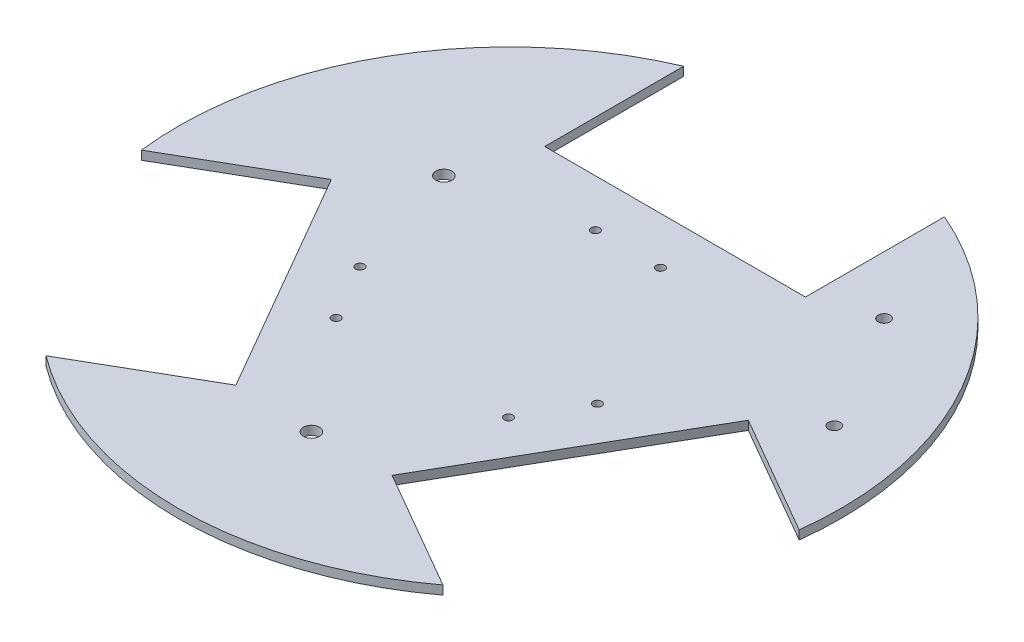
ISO-10303-21;
HEADER;
FILE_DESCRIPTION(('STEP AP214'),'2;1');
FILE_NAME('part.step','',(''),(''),'','','');
FILE_SCHEMA(('AUTOMOTIVE_DESIGN { 1 0 10303 214 1 1 1 1 }'));
ENDSEC;
DATA;
#1=APPLICATION_CONTEXT('core data for automotive mechanical design processes');
#2=APPLICATION_PROTOCOL_DEFINITION('international standard','automotive_design',2000,#1);
#3=PRODUCT_CONTEXT('',#1,'mechanical');
#4=PRODUCT('Part','Part','',(#3));
#5=PRODUCT_RELATED_PRODUCT_CATEGORY('part','',(#4));
#6=PRODUCT_DEFINITION_FORMATION('','',#4);
#7=PRODUCT_DEFINITION_CONTEXT('part definition',#1,'design');
#8=PRODUCT_DEFINITION('design','',#6,#7);
#9=PRODUCT_DEFINITION_SHAPE('','',#8);
#10=(LENGTH_UNIT() NAMED_UNIT(*) SI_UNIT(.MILLI.,.METRE.));
#11=(NAMED_UNIT(*) PLANE_ANGLE_UNIT() SI_UNIT($,.RADIAN.));
#12=(NAMED_UNIT(*) SI_UNIT($,.STERADIAN.) SOLID_ANGLE_UNIT());
#13=UNCERTAINTY_MEASURE_WITH_UNIT(LENGTH_MEASURE(1.E-05),#10,'distance_accuracy_value','');
#14=(GEOMETRIC_REPRESENTATION_CONTEXT(3) GLOBAL_UNCERTAINTY_ASSIGNED_CONTEXT((#13)) GLOBAL_UNIT_ASSIGNED_CONTEXT((#10,
#11,#12)) REPRESENTATION_CONTEXT('',''));
#15=CARTESIAN_POINT('',(0.,0.,0.));
#16=DIRECTION('',(0.,0.,1.));
#17=DIRECTION('',(1.,0.,0.));
#18=AXIS2_PLACEMENT_3D('',#15,#16,#17);
#19=CARTESIAN_POINT('',(0.,2.3622,0.));
#20=DIRECTION('',(0.,1.,0.));
#21=DIRECTION('',(0.,0.,1.));
#22=AXIS2_PLACEMENT_3D('',#19,#20,#21);
#23=PLANE('',#22);
#24=CARTESIAN_POINT('',(-31.8619315701551,2.3622,8.31351569320629));
#25=DIRECTION('',(0.,1.,0.));
#26=DIRECTION('',(0.,0.,1.));
#27=AXIS2_PLACEMENT_3D('',#24,#25,#26);
#28=CIRCLE('',#27,1.14935);
#29=CARTESIAN_POINT('',(-31.8619315701551,2.3622,9.46286569320629));
#30=VERTEX_POINT('',#29);
#31=EDGE_CURVE('E315',#30,#30,#28,.T.);
#32=ORIENTED_EDGE('',*,*,#31,.F.);
#33=EDGE_LOOP('',(#32));
#34=FACE_BOUND('',#33,.T.);
#35=CARTESIAN_POINT('',(31.8619315701559,2.3622,8.31351569320727));
#36=DIRECTION('',(0.,1.,0.));
#37=DIRECTION('',(0.,0.,1.));
#38=AXIS2_PLACEMENT_3D('',#35,#36,#37);
#39=CIRCLE('',#38,1.14935);
#40=CARTESIAN_POINT('',(31.8619315701559,2.3622,9.46286569320727));
#41=VERTEX_POINT('',#40);
#42=EDGE_CURVE('E327',#41,#41,#39,.T.);
#43=ORIENTED_EDGE('',*,*,#42,.F.);
#44=EDGE_LOOP('',(#43));
#45=FACE_BOUND('',#44,.T.);
#46=CARTESIAN_POINT('',(0.,2.3622,53.2057621135311));
#47=DIRECTION('',(0.,1.,0.));
#48=DIRECTION('',(0.,0.,-1.));
#49=AXIS2_PLACEMENT_3D('',#46,#47,#48);
#50=CIRCLE('',#49,2.1463);
#51=CARTESIAN_POINT('',(0.,2.3622,51.0594621135311));
#52=VERTEX_POINT('',#51);
#53=EDGE_CURVE('E339',#52,#52,#50,.T.);
#54=ORIENTED_EDGE('',*,*,#53,.F.);
#55=EDGE_LOOP('',(#54));
#56=FACE_BOUND('',#55,.T.);
#57=CARTESIAN_POINT('',(-8.73125,2.3622,-31.75));
#58=DIRECTION('',(0.,1.,0.));
#59=DIRECTION('',(0.,0.,1.));
#60=AXIS2_PLACEMENT_3D('',#57,#58,#59);
#61=CIRCLE('',#60,1.14935);
#62=CARTESIAN_POINT('',(-8.73125,2.3622,-30.60065));
#63=VERTEX_POINT('',#62);
#64=EDGE_CURVE('E351',#63,#63,#61,.T.);
#65=ORIENTED_EDGE('',*,*,#64,.F.);
#66=EDGE_LOOP('',(#65));
#67=FACE_BOUND('',#66,.T.);
#68=CARTESIAN_POINT('',(-41.7474145991068,2.3622,-24.1028810567702));
#69=DIRECTION('',(0.,1.,0.));
#70=DIRECTION('',(0.,0.,1.));
#71=AXIS2_PLACEMENT_3D('',#68,#69,#70);
#72=CIRCLE('',#71,2.1463);
#73=CARTESIAN_POINT('',(-41.7474145991068,2.3622,-21.9565810567702));
#74=VERTEX_POINT('',#73);
#75=EDGE_CURVE('E157',#74,#74,#72,.T.);
#76=ORIENTED_EDGE('',*,*,#75,.F.);
#77=EDGE_LOOP('',(#76));
#78=FACE_BOUND('',#77,.T.);
#79=CARTESIAN_POINT('',(0.,2.3622,0.));
#80=DIRECTION('',(0.,1.,0.));
#81=DIRECTION('',(0.,0.,1.));
#82=AXIS2_PLACEMENT_3D('',#79,#80,#81);
#83=CIRCLE('',#82,88.9);
#84=CARTESIAN_POINT('',(-53.2718694115166,2.3622,71.1710469882404));
#85=VERTEX_POINT('',#84);
#86=CARTESIAN_POINT('',(53.271869411513,2.3622,71.1710469882431));
#87=VERTEX_POINT('',#86);
#88=EDGE_CURVE('E176',#85,#87,#83,.T.);
#89=ORIENTED_EDGE('',*,*,#88,.T.);
#90=DIRECTION('',(-0.866025403784439,0.,-0.5));
#91=VECTOR('',#90,1.);
#92=CARTESIAN_POINT('',(20.9618354824669,2.3622,52.5168402017824));
#93=LINE('',#92,#91);
#94=CARTESIAN_POINT('',(20.9618354824669,2.3622,52.5168402017824));
#95=VERTEX_POINT('',#94);
#96=EDGE_CURVE('E104',#87,#95,#93,.T.);
#97=ORIENTED_EDGE('',*,*,#96,.T.);
#98=DIRECTION('',(0.5,0.,-0.866025403784439));
#99=VECTOR('',#98,1.);
#100=CARTESIAN_POINT('',(55.9618354824629,2.3622,-8.10493806312137));
#101=LINE('',#100,#99);
#102=CARTESIAN_POINT('',(55.9618354824629,2.3622,-8.10493806312137));
#103=VERTEX_POINT('',#102);
#104=EDGE_CURVE('E203',#95,#103,#101,.T.);
#105=ORIENTED_EDGE('',*,*,#104,.T.);
#106=DIRECTION('',(0.866025403784437,0.,0.500000000000002));
#107=VECTOR('',#106,1.);
#108=CARTESIAN_POINT('',(55.9618354824629,2.3622,-8.10493806312137));
#109=LINE('',#108,#107);
#110=CARTESIAN_POINT('',(88.2718694115104,2.3622,10.5492687233403));
#111=VERTEX_POINT('',#110);
#112=EDGE_CURVE('E222',#103,#111,#109,.T.);
#113=ORIENTED_EDGE('',*,*,#112,.T.);
#114=CARTESIAN_POINT('',(0.,2.3622,0.));
#115=DIRECTION('',(0.,1.,0.));
#116=DIRECTION('',(0.,0.,1.));
#117=AXIS2_PLACEMENT_3D('',#114,#115,#116);
#118=CIRCLE('',#117,88.9);
#119=CARTESIAN_POINT('',(34.999999999998,2.3622,-81.7203157115789));
#120=VERTEX_POINT('',#119);
#121=EDGE_CURVE('E219',#111,#120,#118,.T.);
#122=ORIENTED_EDGE('',*,*,#121,.T.);
#123=DIRECTION('',(0.,0.,1.));
#124=VECTOR('',#123,1.);
#125=CARTESIAN_POINT('',(34.999999999998,2.3622,-44.4119021386576));
#126=LINE('',#125,#124);
#127=CARTESIAN_POINT('',(34.999999999998,2.3622,-44.4119021386576));
#128=VERTEX_POINT('',#127);
#129=EDGE_CURVE('E221',#120,#128,#126,.T.);
#130=ORIENTED_EDGE('',*,*,#129,.T.);
#131=DIRECTION('',(-1.,0.,0.));
#132=VECTOR('',#131,1.);
#133=CARTESIAN_POINT('',(-34.999999999994,2.3622,-44.4119021386576));
#134=LINE('',#133,#132);
#135=CARTESIAN_POINT('',(-34.999999999994,2.3622,-44.4119021386576));
#136=VERTEX_POINT('',#135);
#137=EDGE_CURVE('E224',#128,#136,#134,.T.);
#138=ORIENTED_EDGE('',*,*,#137,.T.);
#139=DIRECTION('',(0.,0.,-1.));
#140=VECTOR('',#139,1.);
#141=CARTESIAN_POINT('',(-34.999999999994,2.3622,-44.4119021386576));
#142=LINE('',#141,#140);
#143=CARTESIAN_POINT('',(-34.9999999999939,2.3622,-81.7203157115807));
#144=VERTEX_POINT('',#143);
#145=EDGE_CURVE('E230',#136,#144,#142,.T.);
#146=ORIENTED_EDGE('',*,*,#145,.T.);
#147=CARTESIAN_POINT('',(0.,2.3622,0.));
#148=DIRECTION('',(0.,1.,0.));
#149=DIRECTION('',(0.,0.,1.));
#150=AXIS2_PLACEMENT_3D('',#147,#148,#149);
#151=CIRCLE('',#150,88.9);
#152=CARTESIAN_POINT('',(-88.271869411511,2.3622,10.5492687233358));
#153=VERTEX_POINT('',#152);
#154=EDGE_CURVE('E135',#144,#153,#151,.T.);
#155=ORIENTED_EDGE('',*,*,#154,.T.);
#156=DIRECTION('',(0.866025403784439,0.,-0.5));
#157=VECTOR('',#156,1.);
#158=CARTESIAN_POINT('',(-55.9618354824649,2.3622,-8.10493806312486));
#159=LINE('',#158,#157);
#160=CARTESIAN_POINT('',(-55.9618354824649,2.3622,-8.10493806312486));
#161=VERTEX_POINT('',#160);
#162=EDGE_CURVE('E129',#153,#161,#159,.T.);
#163=ORIENTED_EDGE('',*,*,#162,.T.);
#164=DIRECTION('',(0.5,0.,0.866025403784439));
#165=VECTOR('',#164,1.);
#166=CARTESIAN_POINT('',(-20.9618354824689,2.3622,52.5168402017789));
#167=LINE('',#166,#165);
#168=CARTESIAN_POINT('',(-20.9618354824689,2.3622,52.5168402017789));
#169=VERTEX_POINT('',#168);
#170=EDGE_CURVE('E133',#161,#169,#167,.T.);
#171=ORIENTED_EDGE('',*,*,#170,.T.);
#172=DIRECTION('',(-0.86602540378444,0.,0.499999999999997));
#173=VECTOR('',#172,1.);
#174=CARTESIAN_POINT('',(-20.9618354824689,2.3622,52.5168402017789));
#175=LINE('',#174,#173);
#176=EDGE_CURVE('E49',#169,#85,#175,.T.);
#177=ORIENTED_EDGE('',*,*,#176,.T.);
#178=EDGE_LOOP('',(#89,#97,#105,#113,#122,#130,#138,#146,#155,#163,#171,#177));
#179=FACE_BOUND('',#178,.T.);
#180=CARTESIAN_POINT('',(50.5294069110364,2.3622,-49.9813550256619));
#181=DIRECTION('',(0.,1.,0.));
#182=DIRECTION('',(0.,0.,1.));
#183=AXIS2_PLACEMENT_3D('',#180,#181,#182);
#184=CIRCLE('',#183,1.5875);
#185=CARTESIAN_POINT('',(50.5294069110364,2.3622,-48.3938550256619));
#186=VERTEX_POINT('',#185);
#187=EDGE_CURVE('E357',#186,#186,#184,.T.);
#188=ORIENTED_EDGE('',*,*,#187,.F.);
#189=EDGE_LOOP('',(#188));
#190=FACE_BOUND('',#189,.T.);
#191=CARTESIAN_POINT('',(68.7856569110362,2.3622,-18.3606024699824));
#192=DIRECTION('',(0.,1.,0.));
#193=DIRECTION('',(0.,0.,1.));
#194=AXIS2_PLACEMENT_3D('',#191,#192,#193);
#195=CIRCLE('',#194,1.5875);
#196=CARTESIAN_POINT('',(68.7856569110362,2.3622,-16.7731024699824));
#197=VERTEX_POINT('',#196);
#198=EDGE_CURVE('E345',#197,#197,#195,.T.);
#199=ORIENTED_EDGE('',*,*,#198,.F.);
#200=EDGE_LOOP('',(#199));
#201=FACE_BOUND('',#200,.T.);
#202=CARTESIAN_POINT('',(8.73125,2.3622,-31.7499999999989));
#203=DIRECTION('',(0.,1.,0.));
#204=DIRECTION('',(0.,0.,1.));
#205=AXIS2_PLACEMENT_3D('',#202,#203,#204);
#206=CIRCLE('',#205,1.14935);
#207=CARTESIAN_POINT('',(8.73125,2.3622,-30.6006499999989));
#208=VERTEX_POINT('',#207);
#209=EDGE_CURVE('E333',#208,#208,#206,.T.);
#210=ORIENTED_EDGE('',*,*,#209,.F.);
#211=EDGE_LOOP('',(#210));
#212=FACE_BOUND('',#211,.T.);
#213=CARTESIAN_POINT('',(23.1306815701549,2.3622,23.4364843067925));
#214=DIRECTION('',(0.,1.,0.));
#215=DIRECTION('',(0.,0.,1.));
#216=AXIS2_PLACEMENT_3D('',#213,#214,#215);
#217=CIRCLE('',#216,1.14935);
#218=CARTESIAN_POINT('',(23.1306815701549,2.3622,24.5858343067925));
#219=VERTEX_POINT('',#218);
#220=EDGE_CURVE('E321',#219,#219,#217,.T.);
#221=ORIENTED_EDGE('',*,*,#220,.F.);
#222=EDGE_LOOP('',(#221));
#223=FACE_BOUND('',#222,.T.);
#224=CARTESIAN_POINT('',(-23.1306815701561,2.3622,23.4364843067927));
#225=DIRECTION('',(0.,1.,0.));
#226=DIRECTION('',(0.,0.,1.));
#227=AXIS2_PLACEMENT_3D('',#224,#225,#226);
#228=CIRCLE('',#227,1.14935);
#229=CARTESIAN_POINT('',(-23.1306815701561,2.3622,24.5858343067927));
#230=VERTEX_POINT('',#229);
#231=EDGE_CURVE('E306',#230,#230,#228,.T.);
#232=ORIENTED_EDGE('',*,*,#231,.F.);
#233=EDGE_LOOP('',(#232));
#234=FACE_BOUND('',#233,.T.);
#235=ADVANCED_FACE('F32',(#34,#45,#56,#67,#78,#179,#190,#201,#212,#223,#234),#23,.T.);
#236=CARTESIAN_POINT('',(0.,0.,0.));
#237=DIRECTION('',(0.,1.,0.));
#238=DIRECTION('',(0.,0.,1.));
#239=AXIS2_PLACEMENT_3D('',#236,#237,#238);
#240=PLANE('',#239);
#241=CARTESIAN_POINT('',(-31.8619315701551,0.,8.31351569320629));
#242=DIRECTION('',(0.,1.,0.));
#243=DIRECTION('',(0.,0.,1.));
#244=AXIS2_PLACEMENT_3D('',#241,#242,#243);
#245=CIRCLE('',#244,1.14935);
#246=CARTESIAN_POINT('',(-31.8619315701551,0.,9.46286569320629));
#247=VERTEX_POINT('',#246);
#248=EDGE_CURVE('E312',#247,#247,#245,.T.);
#249=ORIENTED_EDGE('',*,*,#248,.T.);
#250=EDGE_LOOP('',(#249));
#251=FACE_BOUND('',#250,.T.);
#252=CARTESIAN_POINT('',(31.8619315701559,0.,8.31351569320727));
#253=DIRECTION('',(0.,1.,0.));
#254=DIRECTION('',(0.,0.,1.));
#255=AXIS2_PLACEMENT_3D('',#252,#253,#254);
#256=CIRCLE('',#255,1.14935);
#257=CARTESIAN_POINT('',(31.8619315701559,0.,9.46286569320727));
#258=VERTEX_POINT('',#257);
#259=EDGE_CURVE('E324',#258,#258,#256,.T.);
#260=ORIENTED_EDGE('',*,*,#259,.T.);
#261=EDGE_LOOP('',(#260));
#262=FACE_BOUND('',#261,.T.);
#263=CARTESIAN_POINT('',(0.,0.,53.2057621135311));
#264=DIRECTION('',(0.,1.,0.));
#265=DIRECTION('',(0.,0.,-1.));
#266=AXIS2_PLACEMENT_3D('',#263,#264,#265);
#267=CIRCLE('',#266,2.1463);
#268=CARTESIAN_POINT('',(0.,0.,51.0594621135311));
#269=VERTEX_POINT('',#268);
#270=EDGE_CURVE('E336',#269,#269,#267,.T.);
#271=ORIENTED_EDGE('',*,*,#270,.T.);
#272=EDGE_LOOP('',(#271));
#273=FACE_BOUND('',#272,.T.);
#274=CARTESIAN_POINT('',(-8.73125,0.,-31.75));
#275=DIRECTION('',(0.,1.,0.));
#276=DIRECTION('',(0.,0.,1.));
#277=AXIS2_PLACEMENT_3D('',#274,#275,#276);
#278=CIRCLE('',#277,1.14935);
#279=CARTESIAN_POINT('',(-8.73125,0.,-30.60065));
#280=VERTEX_POINT('',#279);
#281=EDGE_CURVE('E348',#280,#280,#278,.T.);
#282=ORIENTED_EDGE('',*,*,#281,.T.);
#283=EDGE_LOOP('',(#282));
#284=FACE_BOUND('',#283,.T.);
#285=CARTESIAN_POINT('',(-41.7474145991068,0.,-24.1028810567702));
#286=DIRECTION('',(0.,1.,0.));
#287=DIRECTION('',(0.,0.,1.));
#288=AXIS2_PLACEMENT_3D('',#285,#286,#287);
#289=CIRCLE('',#288,2.1463);
#290=CARTESIAN_POINT('',(-41.7474145991068,0.,-21.9565810567702));
#291=VERTEX_POINT('',#290);
#292=EDGE_CURVE('E360',#291,#291,#289,.T.);
#293=ORIENTED_EDGE('',*,*,#292,.T.);
#294=EDGE_LOOP('',(#293));
#295=FACE_BOUND('',#294,.T.);
#296=CARTESIAN_POINT('',(0.,0.,0.));
#297=DIRECTION('',(0.,1.,0.));
#298=DIRECTION('',(0.,0.,1.));
#299=AXIS2_PLACEMENT_3D('',#296,#297,#298);
#300=CIRCLE('',#299,88.9);
#301=CARTESIAN_POINT('',(-53.2718694115166,0.,71.1710469882404));
#302=VERTEX_POINT('',#301);
#303=CARTESIAN_POINT('',(53.271869411513,0.,71.1710469882431));
#304=VERTEX_POINT('',#303);
#305=EDGE_CURVE('E153',#302,#304,#300,.T.);
#306=ORIENTED_EDGE('',*,*,#305,.F.);
#307=DIRECTION('',(-0.86602540378444,0.,0.499999999999997));
#308=VECTOR('',#307,1.);
#309=CARTESIAN_POINT('',(-20.9618354824689,0.,52.5168402017789));
#310=LINE('',#309,#308);
#311=CARTESIAN_POINT('',(-20.9618354824689,0.,52.5168402017789));
#312=VERTEX_POINT('',#311);
#313=EDGE_CURVE('E96',#312,#302,#310,.T.);
#314=ORIENTED_EDGE('',*,*,#313,.F.);
#315=DIRECTION('',(0.5,0.,0.866025403784439));
#316=VECTOR('',#315,1.);
#317=CARTESIAN_POINT('',(-20.9618354824689,0.,52.5168402017789));
#318=LINE('',#317,#316);
#319=CARTESIAN_POINT('',(-55.9618354824649,0.,-8.10493806312486));
#320=VERTEX_POINT('',#319);
#321=EDGE_CURVE('E90',#320,#312,#318,.T.);
#322=ORIENTED_EDGE('',*,*,#321,.F.);
#323=DIRECTION('',(0.866025403784439,0.,-0.5));
#324=VECTOR('',#323,1.);
#325=CARTESIAN_POINT('',(-55.9618354824649,0.,-8.10493806312486));
#326=LINE('',#325,#324);
#327=CARTESIAN_POINT('',(-88.271869411511,0.,10.5492687233358));
#328=VERTEX_POINT('',#327);
#329=EDGE_CURVE('E143',#328,#320,#326,.T.);
#330=ORIENTED_EDGE('',*,*,#329,.F.);
#331=CARTESIAN_POINT('',(0.,0.,0.));
#332=DIRECTION('',(0.,1.,0.));
#333=DIRECTION('',(0.,0.,1.));
#334=AXIS2_PLACEMENT_3D('',#331,#332,#333);
#335=CIRCLE('',#334,88.9);
#336=CARTESIAN_POINT('',(-34.9999999999939,0.,-81.7203157115807));
#337=VERTEX_POINT('',#336);
#338=EDGE_CURVE('E171',#337,#328,#335,.T.);
#339=ORIENTED_EDGE('',*,*,#338,.F.);
#340=DIRECTION('',(0.,0.,-1.));
#341=VECTOR('',#340,1.);
#342=CARTESIAN_POINT('',(-34.999999999994,0.,-44.4119021386576));
#343=LINE('',#342,#341);
#344=CARTESIAN_POINT('',(-34.999999999994,0.,-44.4119021386576));
#345=VERTEX_POINT('',#344);
#346=EDGE_CURVE('E169',#345,#337,#343,.T.);
#347=ORIENTED_EDGE('',*,*,#346,.F.);
#348=DIRECTION('',(-1.,0.,0.));
#349=VECTOR('',#348,1.);
#350=CARTESIAN_POINT('',(-34.999999999994,0.,-44.4119021386576));
#351=LINE('',#350,#349);
#352=CARTESIAN_POINT('',(34.999999999998,0.,-44.4119021386576));
#353=VERTEX_POINT('',#352);
#354=EDGE_CURVE('E167',#353,#345,#351,.T.);
#355=ORIENTED_EDGE('',*,*,#354,.F.);
#356=DIRECTION('',(0.,0.,1.));
#357=VECTOR('',#356,1.);
#358=CARTESIAN_POINT('',(34.999999999998,0.,-44.4119021386576));
#359=LINE('',#358,#357);
#360=CARTESIAN_POINT('',(34.999999999998,0.,-81.7203157115789));
#361=VERTEX_POINT('',#360);
#362=EDGE_CURVE('E165',#361,#353,#359,.T.);
#363=ORIENTED_EDGE('',*,*,#362,.F.);
#364=CARTESIAN_POINT('',(0.,0.,0.));
#365=DIRECTION('',(0.,1.,0.));
#366=DIRECTION('',(0.,0.,1.));
#367=AXIS2_PLACEMENT_3D('',#364,#365,#366);
#368=CIRCLE('',#367,88.9);
#369=CARTESIAN_POINT('',(88.2718694115104,0.,10.5492687233403));
#370=VERTEX_POINT('',#369);
#371=EDGE_CURVE('E163',#370,#361,#368,.T.);
#372=ORIENTED_EDGE('',*,*,#371,.F.);
#373=DIRECTION('',(0.866025403784437,0.,0.500000000000002));
#374=VECTOR('',#373,1.);
#375=CARTESIAN_POINT('',(55.9618354824629,0.,-8.10493806312137));
#376=LINE('',#375,#374);
#377=CARTESIAN_POINT('',(55.9618354824629,0.,-8.10493806312137));
#378=VERTEX_POINT('',#377);
#379=EDGE_CURVE('E161',#378,#370,#376,.T.);
#380=ORIENTED_EDGE('',*,*,#379,.F.);
#381=DIRECTION('',(0.5,0.,-0.866025403784439));
#382=VECTOR('',#381,1.);
#383=CARTESIAN_POINT('',(55.9618354824629,0.,-8.10493806312137));
#384=LINE('',#383,#382);
#385=CARTESIAN_POINT('',(20.9618354824669,0.,52.5168402017824));
#386=VERTEX_POINT('',#385);
#387=EDGE_CURVE('E159',#386,#378,#384,.T.);
#388=ORIENTED_EDGE('',*,*,#387,.F.);
#389=DIRECTION('',(-0.866025403784439,0.,-0.5));
#390=VECTOR('',#389,1.);
#391=CARTESIAN_POINT('',(20.9618354824669,0.,52.5168402017824));
#392=LINE('',#391,#390);
#393=EDGE_CURVE('E156',#304,#386,#392,.T.);
#394=ORIENTED_EDGE('',*,*,#393,.F.);
#395=EDGE_LOOP('',(#306,#314,#322,#330,#339,#347,#355,#363,#372,#380,#388,#394));
#396=FACE_BOUND('',#395,.T.);
#397=CARTESIAN_POINT('',(50.5294069110364,0.,-49.9813550256619));
#398=DIRECTION('',(0.,1.,0.));
#399=DIRECTION('',(0.,0.,1.));
#400=AXIS2_PLACEMENT_3D('',#397,#398,#399);
#401=CIRCLE('',#400,1.5875);
#402=CARTESIAN_POINT('',(50.5294069110364,0.,-48.3938550256619));
#403=VERTEX_POINT('',#402);
#404=EDGE_CURVE('E354',#403,#403,#401,.T.);
#405=ORIENTED_EDGE('',*,*,#404,.T.);
#406=EDGE_LOOP('',(#405));
#407=FACE_BOUND('',#406,.T.);
#408=CARTESIAN_POINT('',(68.7856569110362,0.,-18.3606024699824));
#409=DIRECTION('',(0.,1.,0.));
#410=DIRECTION('',(0.,0.,1.));
#411=AXIS2_PLACEMENT_3D('',#408,#409,#410);
#412=CIRCLE('',#411,1.5875);
#413=CARTESIAN_POINT('',(68.7856569110362,0.,-16.7731024699824));
#414=VERTEX_POINT('',#413);
#415=EDGE_CURVE('E342',#414,#414,#412,.T.);
#416=ORIENTED_EDGE('',*,*,#415,.T.);
#417=EDGE_LOOP('',(#416));
#418=FACE_BOUND('',#417,.T.);
#419=CARTESIAN_POINT('',(8.73125,0.,-31.7499999999989));
#420=DIRECTION('',(0.,1.,0.));
#421=DIRECTION('',(0.,0.,1.));
#422=AXIS2_PLACEMENT_3D('',#419,#420,#421);
#423=CIRCLE('',#422,1.14935);
#424=CARTESIAN_POINT('',(8.73125,0.,-30.6006499999989));
#425=VERTEX_POINT('',#424);
#426=EDGE_CURVE('E330',#425,#425,#423,.T.);
#427=ORIENTED_EDGE('',*,*,#426,.T.);
#428=EDGE_LOOP('',(#427));
#429=FACE_BOUND('',#428,.T.);
#430=CARTESIAN_POINT('',(23.1306815701549,0.,23.4364843067925));
#431=DIRECTION('',(0.,1.,0.));
#432=DIRECTION('',(0.,0.,1.));
#433=AXIS2_PLACEMENT_3D('',#430,#431,#432);
#434=CIRCLE('',#433,1.14935);
#435=CARTESIAN_POINT('',(23.1306815701549,0.,24.5858343067925));
#436=VERTEX_POINT('',#435);
#437=EDGE_CURVE('E318',#436,#436,#434,.T.);
#438=ORIENTED_EDGE('',*,*,#437,.T.);
#439=EDGE_LOOP('',(#438));
#440=FACE_BOUND('',#439,.T.);
#441=CARTESIAN_POINT('',(-23.1306815701561,0.,23.4364843067927));
#442=DIRECTION('',(0.,1.,0.));
#443=DIRECTION('',(0.,0.,1.));
#444=AXIS2_PLACEMENT_3D('',#441,#442,#443);
#445=CIRCLE('',#444,1.14935);
#446=CARTESIAN_POINT('',(-23.1306815701561,0.,24.5858343067927));
#447=VERTEX_POINT('',#446);
#448=EDGE_CURVE('E309',#447,#447,#445,.T.);
#449=ORIENTED_EDGE('',*,*,#448,.T.);
#450=EDGE_LOOP('',(#449));
#451=FACE_BOUND('',#450,.T.);
#452=ADVANCED_FACE('F207',(#251,#262,#273,#284,#295,#396,#407,#418,#429,#440,#451),#240,.F.);
#453=CARTESIAN_POINT('',(0.,2.3622,0.));
#454=DIRECTION('',(0.,-1.,0.));
#455=DIRECTION('',(0.,0.,-1.));
#456=AXIS2_PLACEMENT_3D('',#453,#454,#455);
#457=CYLINDRICAL_SURFACE('',#456,88.9);
#458=ORIENTED_EDGE('',*,*,#305,.T.);
#459=DIRECTION('',(0.,-1.,0.));
#460=VECTOR('',#459,1.);
#461=CARTESIAN_POINT('',(53.271869411513,2.3622,71.1710469882431));
#462=LINE('',#461,#460);
#463=EDGE_CURVE('E11',#87,#304,#462,.T.);
#464=ORIENTED_EDGE('',*,*,#463,.F.);
#465=ORIENTED_EDGE('',*,*,#88,.F.);
#466=DIRECTION('',(0.,-1.,0.));
#467=VECTOR('',#466,1.);
#468=CARTESIAN_POINT('',(-53.2718694115166,2.3622,71.1710469882404));
#469=LINE('',#468,#467);
#470=EDGE_CURVE('E149',#85,#302,#469,.T.);
#471=ORIENTED_EDGE('',*,*,#470,.T.);
#472=EDGE_LOOP('',(#458,#464,#465,#471));
#473=FACE_BOUND('',#472,.T.);
#474=ADVANCED_FACE('F34',(#473),#457,.T.);
#475=CARTESIAN_POINT('',(20.9618354824669,2.3622,52.5168402017824));
#476=DIRECTION('',(-0.5,0.,0.866025403784439));
#477=DIRECTION('',(0.866025403784439,0.,0.5));
#478=AXIS2_PLACEMENT_3D('',#475,#476,#477);
#479=PLANE('',#478);
#480=ORIENTED_EDGE('',*,*,#393,.T.);
#481=DIRECTION('',(0.,-1.,0.));
#482=VECTOR('',#481,1.);
#483=CARTESIAN_POINT('',(20.9618354824669,2.3622,52.5168402017824));
#484=LINE('',#483,#482);
#485=EDGE_CURVE('E41',#95,#386,#484,.T.);
#486=ORIENTED_EDGE('',*,*,#485,.F.);
#487=ORIENTED_EDGE('',*,*,#96,.F.);
#488=ORIENTED_EDGE('',*,*,#463,.T.);
#489=EDGE_LOOP('',(#480,#486,#487,#488));
#490=FACE_BOUND('',#489,.T.);
#491=ADVANCED_FACE('F523',(#490),#479,.F.);
#492=CARTESIAN_POINT('',(55.9618354824629,2.3622,-8.10493806312137));
#493=DIRECTION('',(-0.866025403784439,0.,-0.5));
#494=DIRECTION('',(-0.5,0.,0.866025403784439));
#495=AXIS2_PLACEMENT_3D('',#492,#493,#494);
#496=PLANE('',#495);
#497=ORIENTED_EDGE('',*,*,#387,.T.);
#498=DIRECTION('',(0.,-1.,0.));
#499=VECTOR('',#498,1.);
#500=CARTESIAN_POINT('',(55.9618354824629,2.3622,-8.10493806312137));
#501=LINE('',#500,#499);
#502=EDGE_CURVE('E195',#103,#378,#501,.T.);
#503=ORIENTED_EDGE('',*,*,#502,.F.);
#504=ORIENTED_EDGE('',*,*,#104,.F.);
#505=ORIENTED_EDGE('',*,*,#485,.T.);
#506=EDGE_LOOP('',(#497,#503,#504,#505));
#507=FACE_BOUND('',#506,.T.);
#508=ADVANCED_FACE('F201',(#507),#496,.F.);
#509=CARTESIAN_POINT('',(55.9618354824629,2.3622,-8.10493806312137));
#510=DIRECTION('',(0.500000000000002,0.,-0.866025403784437));
#511=DIRECTION('',(-0.866025403784437,0.,-0.500000000000002));
#512=AXIS2_PLACEMENT_3D('',#509,#510,#511);
#513=PLANE('',#512);
#514=ORIENTED_EDGE('',*,*,#379,.T.);
#515=DIRECTION('',(0.,-1.,0.));
#516=VECTOR('',#515,1.);
#517=CARTESIAN_POINT('',(88.2718694115104,2.3622,10.5492687233403));
#518=LINE('',#517,#516);
#519=EDGE_CURVE('E192',#111,#370,#518,.T.);
#520=ORIENTED_EDGE('',*,*,#519,.F.);
#521=ORIENTED_EDGE('',*,*,#112,.F.);
#522=ORIENTED_EDGE('',*,*,#502,.T.);
#523=EDGE_LOOP('',(#514,#520,#521,#522));
#524=FACE_BOUND('',#523,.T.);
#525=ADVANCED_FACE('F213',(#524),#513,.F.);
#526=CARTESIAN_POINT('',(0.,2.3622,0.));
#527=DIRECTION('',(0.,-1.,0.));
#528=DIRECTION('',(0.,0.,-1.));
#529=AXIS2_PLACEMENT_3D('',#526,#527,#528);
#530=CYLINDRICAL_SURFACE('',#529,88.9);
#531=ORIENTED_EDGE('',*,*,#371,.T.);
#532=DIRECTION('',(0.,-1.,0.));
#533=VECTOR('',#532,1.);
#534=CARTESIAN_POINT('',(34.999999999998,2.3622,-81.7203157115789));
#535=LINE('',#534,#533);
#536=EDGE_CURVE('E189',#120,#361,#535,.T.);
#537=ORIENTED_EDGE('',*,*,#536,.F.);
#538=ORIENTED_EDGE('',*,*,#121,.F.);
#539=ORIENTED_EDGE('',*,*,#519,.T.);
#540=EDGE_LOOP('',(#531,#537,#538,#539));
#541=FACE_BOUND('',#540,.T.);
#542=ADVANCED_FACE('F217',(#541),#530,.T.);
#543=CARTESIAN_POINT('',(34.999999999998,2.3622,-44.4119021386576));
#544=DIRECTION('',(1.,0.,0.));
#545=DIRECTION('',(0.,0.,-1.));
#546=AXIS2_PLACEMENT_3D('',#543,#544,#545);
#547=PLANE('',#546);
#548=ORIENTED_EDGE('',*,*,#362,.T.);
#549=DIRECTION('',(0.,-1.,0.));
#550=VECTOR('',#549,1.);
#551=CARTESIAN_POINT('',(34.999999999998,2.3622,-44.4119021386576));
#552=LINE('',#551,#550);
#553=EDGE_CURVE('E186',#128,#353,#552,.T.);
#554=ORIENTED_EDGE('',*,*,#553,.F.);
#555=ORIENTED_EDGE('',*,*,#129,.F.);
#556=ORIENTED_EDGE('',*,*,#536,.T.);
#557=EDGE_LOOP('',(#548,#554,#555,#556));
#558=FACE_BOUND('',#557,.T.);
#559=ADVANCED_FACE('F488',(#558),#547,.F.);
#560=CARTESIAN_POINT('',(-34.999999999994,2.3622,-44.4119021386576));
#561=DIRECTION('',(0.,0.,1.));
#562=DIRECTION('',(1.,0.,0.));
#563=AXIS2_PLACEMENT_3D('',#560,#561,#562);
#564=PLANE('',#563);
#565=ORIENTED_EDGE('',*,*,#354,.T.);
#566=DIRECTION('',(0.,-1.,0.));
#567=VECTOR('',#566,1.);
#568=CARTESIAN_POINT('',(-34.999999999994,2.3622,-44.4119021386576));
#569=LINE('',#568,#567);
#570=EDGE_CURVE('E183',#136,#345,#569,.T.);
#571=ORIENTED_EDGE('',*,*,#570,.F.);
#572=ORIENTED_EDGE('',*,*,#137,.F.);
#573=ORIENTED_EDGE('',*,*,#553,.T.);
#574=EDGE_LOOP('',(#565,#571,#572,#573));
#575=FACE_BOUND('',#574,.T.);
#576=ADVANCED_FACE('F479',(#575),#564,.F.);
#577=CARTESIAN_POINT('',(-34.999999999994,2.3622,-44.4119021386576));
#578=DIRECTION('',(-1.,0.,0.));
#579=DIRECTION('',(0.,0.,1.));
#580=AXIS2_PLACEMENT_3D('',#577,#578,#579);
#581=PLANE('',#580);
#582=ORIENTED_EDGE('',*,*,#346,.T.);
#583=DIRECTION('',(0.,-1.,0.));
#584=VECTOR('',#583,1.);
#585=CARTESIAN_POINT('',(-34.9999999999939,2.3622,-81.7203157115807));
#586=LINE('',#585,#584);
#587=EDGE_CURVE('E180',#144,#337,#586,.T.);
#588=ORIENTED_EDGE('',*,*,#587,.F.);
#589=ORIENTED_EDGE('',*,*,#145,.F.);
#590=ORIENTED_EDGE('',*,*,#570,.T.);
#591=EDGE_LOOP('',(#582,#588,#589,#590));
#592=FACE_BOUND('',#591,.T.);
#593=ADVANCED_FACE('F236',(#592),#581,.F.);
#594=CARTESIAN_POINT('',(0.,2.3622,0.));
#595=DIRECTION('',(0.,-1.,0.));
#596=DIRECTION('',(0.,0.,-1.));
#597=AXIS2_PLACEMENT_3D('',#594,#595,#596);
#598=CYLINDRICAL_SURFACE('',#597,88.9);
#599=ORIENTED_EDGE('',*,*,#338,.T.);
#600=DIRECTION('',(0.,-1.,0.));
#601=VECTOR('',#600,1.);
#602=CARTESIAN_POINT('',(-88.271869411511,2.3622,10.5492687233358));
#603=LINE('',#602,#601);
#604=EDGE_CURVE('E144',#153,#328,#603,.T.);
#605=ORIENTED_EDGE('',*,*,#604,.F.);
#606=ORIENTED_EDGE('',*,*,#154,.F.);
#607=ORIENTED_EDGE('',*,*,#587,.T.);
#608=EDGE_LOOP('',(#599,#605,#606,#607));
#609=FACE_BOUND('',#608,.T.);
#610=ADVANCED_FACE('F240',(#609),#598,.T.);
#611=CARTESIAN_POINT('',(-55.9618354824649,2.3622,-8.10493806312486));
#612=DIRECTION('',(-0.5,0.,-0.866025403784439));
#613=DIRECTION('',(-0.866025403784439,0.,0.5));
#614=AXIS2_PLACEMENT_3D('',#611,#612,#613);
#615=PLANE('',#614);
#616=ORIENTED_EDGE('',*,*,#329,.T.);
#617=DIRECTION('',(0.,-1.,0.));
#618=VECTOR('',#617,1.);
#619=CARTESIAN_POINT('',(-55.9618354824649,2.3622,-8.10493806312486));
#620=LINE('',#619,#618);
#621=EDGE_CURVE('E140',#161,#320,#620,.T.);
#622=ORIENTED_EDGE('',*,*,#621,.F.);
#623=ORIENTED_EDGE('',*,*,#162,.F.);
#624=ORIENTED_EDGE('',*,*,#604,.T.);
#625=EDGE_LOOP('',(#616,#622,#623,#624));
#626=FACE_BOUND('',#625,.T.);
#627=ADVANCED_FACE('F141',(#626),#615,.F.);
#628=CARTESIAN_POINT('',(-20.9618354824689,2.3622,52.5168402017789));
#629=DIRECTION('',(0.866025403784439,0.,-0.5));
#630=DIRECTION('',(-0.5,0.,-0.866025403784439));
#631=AXIS2_PLACEMENT_3D('',#628,#629,#630);
#632=PLANE('',#631);
#633=ORIENTED_EDGE('',*,*,#321,.T.);
#634=DIRECTION('',(0.,-1.,0.));
#635=VECTOR('',#634,1.);
#636=CARTESIAN_POINT('',(-20.9618354824689,2.3622,52.5168402017789));
#637=LINE('',#636,#635);
#638=EDGE_CURVE('E145',#169,#312,#637,.T.);
#639=ORIENTED_EDGE('',*,*,#638,.F.);
#640=ORIENTED_EDGE('',*,*,#170,.F.);
#641=ORIENTED_EDGE('',*,*,#621,.T.);
#642=EDGE_LOOP('',(#633,#639,#640,#641));
#643=FACE_BOUND('',#642,.T.);
#644=ADVANCED_FACE('F147',(#643),#632,.F.);
#645=CARTESIAN_POINT('',(-20.9618354824689,2.3622,52.5168402017789));
#646=DIRECTION('',(0.499999999999997,0.,0.86602540378444));
#647=DIRECTION('',(0.86602540378444,0.,-0.499999999999997));
#648=AXIS2_PLACEMENT_3D('',#645,#646,#647);
#649=PLANE('',#648);
#650=ORIENTED_EDGE('',*,*,#313,.T.);
#651=ORIENTED_EDGE('',*,*,#470,.F.);
#652=ORIENTED_EDGE('',*,*,#176,.F.);
#653=ORIENTED_EDGE('',*,*,#638,.T.);
#654=EDGE_LOOP('',(#650,#651,#652,#653));
#655=FACE_BOUND('',#654,.T.);
#656=ADVANCED_FACE('F244',(#655),#649,.F.);
#657=CARTESIAN_POINT('',(-41.7474145991068,2.3622,-24.1028810567702));
#658=DIRECTION('',(0.,-1.,0.));
#659=DIRECTION('',(0.,0.,-1.));
#660=AXIS2_PLACEMENT_3D('',#657,#658,#659);
#661=CYLINDRICAL_SURFACE('',#660,2.1463);
#662=ORIENTED_EDGE('',*,*,#75,.T.);
#663=EDGE_LOOP('',(#662));
#664=FACE_BOUND('',#663,.T.);
#665=ORIENTED_EDGE('',*,*,#292,.F.);
#666=EDGE_LOOP('',(#665));
#667=FACE_BOUND('',#666,.T.);
#668=ADVANCED_FACE('F246',(#664,#667),#661,.F.);
#669=CARTESIAN_POINT('',(50.5294069110364,2.3622,-49.9813550256619));
#670=DIRECTION('',(0.,-1.,0.));
#671=DIRECTION('',(0.,0.,-1.));
#672=AXIS2_PLACEMENT_3D('',#669,#670,#671);
#673=CYLINDRICAL_SURFACE('',#672,1.5875);
#674=ORIENTED_EDGE('',*,*,#187,.T.);
#675=EDGE_LOOP('',(#674));
#676=FACE_BOUND('',#675,.T.);
#677=ORIENTED_EDGE('',*,*,#404,.F.);
#678=EDGE_LOOP('',(#677));
#679=FACE_BOUND('',#678,.T.);
#680=ADVANCED_FACE('F252',(#676,#679),#673,.F.);
#681=CARTESIAN_POINT('',(-8.73125,2.3622,-31.75));
#682=DIRECTION('',(0.,-1.,0.));
#683=DIRECTION('',(0.,0.,-1.));
#684=AXIS2_PLACEMENT_3D('',#681,#682,#683);
#685=CYLINDRICAL_SURFACE('',#684,1.14935);
#686=ORIENTED_EDGE('',*,*,#64,.T.);
#687=EDGE_LOOP('',(#686));
#688=FACE_BOUND('',#687,.T.);
#689=ORIENTED_EDGE('',*,*,#281,.F.);
#690=EDGE_LOOP('',(#689));
#691=FACE_BOUND('',#690,.T.);
#692=ADVANCED_FACE('F269',(#688,#691),#685,.F.);
#693=CARTESIAN_POINT('',(68.7856569110362,2.3622,-18.3606024699824));
#694=DIRECTION('',(0.,-1.,0.));
#695=DIRECTION('',(0.,0.,-1.));
#696=AXIS2_PLACEMENT_3D('',#693,#694,#695);
#697=CYLINDRICAL_SURFACE('',#696,1.5875);
#698=ORIENTED_EDGE('',*,*,#198,.T.);
#699=EDGE_LOOP('',(#698));
#700=FACE_BOUND('',#699,.T.);
#701=ORIENTED_EDGE('',*,*,#415,.F.);
#702=EDGE_LOOP('',(#701));
#703=FACE_BOUND('',#702,.T.);
#704=ADVANCED_FACE('F273',(#700,#703),#697,.F.);
#705=CARTESIAN_POINT('',(0.,2.3622,53.2057621135311));
#706=DIRECTION('',(0.,-1.,0.));
#707=DIRECTION('',(0.,0.,-1.));
#708=AXIS2_PLACEMENT_3D('',#705,#706,#707);
#709=CYLINDRICAL_SURFACE('',#708,2.1463);
#710=ORIENTED_EDGE('',*,*,#53,.T.);
#711=EDGE_LOOP('',(#710));
#712=FACE_BOUND('',#711,.T.);
#713=ORIENTED_EDGE('',*,*,#270,.F.);
#714=EDGE_LOOP('',(#713));
#715=FACE_BOUND('',#714,.T.);
#716=ADVANCED_FACE('F277',(#712,#715),#709,.F.);
#717=CARTESIAN_POINT('',(8.73125,2.3622,-31.7499999999989));
#718=DIRECTION('',(0.,-1.,0.));
#719=DIRECTION('',(0.,0.,-1.));
#720=AXIS2_PLACEMENT_3D('',#717,#718,#719);
#721=CYLINDRICAL_SURFACE('',#720,1.14935);
#722=ORIENTED_EDGE('',*,*,#209,.T.);
#723=EDGE_LOOP('',(#722));
#724=FACE_BOUND('',#723,.T.);
#725=ORIENTED_EDGE('',*,*,#426,.F.);
#726=EDGE_LOOP('',(#725));
#727=FACE_BOUND('',#726,.T.);
#728=ADVANCED_FACE('F281',(#724,#727),#721,.F.);
#729=CARTESIAN_POINT('',(31.8619315701559,2.3622,8.31351569320727));
#730=DIRECTION('',(0.,-1.,0.));
#731=DIRECTION('',(0.,0.,-1.));
#732=AXIS2_PLACEMENT_3D('',#729,#730,#731);
#733=CYLINDRICAL_SURFACE('',#732,1.14935);
#734=ORIENTED_EDGE('',*,*,#42,.T.);
#735=EDGE_LOOP('',(#734));
#736=FACE_BOUND('',#735,.T.);
#737=ORIENTED_EDGE('',*,*,#259,.F.);
#738=EDGE_LOOP('',(#737));
#739=FACE_BOUND('',#738,.T.);
#740=ADVANCED_FACE('F285',(#736,#739),#733,.F.);
#741=CARTESIAN_POINT('',(23.1306815701549,2.3622,23.4364843067925));
#742=DIRECTION('',(0.,-1.,0.));
#743=DIRECTION('',(0.,0.,-1.));
#744=AXIS2_PLACEMENT_3D('',#741,#742,#743);
#745=CYLINDRICAL_SURFACE('',#744,1.14935);
#746=ORIENTED_EDGE('',*,*,#220,.T.);
#747=EDGE_LOOP('',(#746));
#748=FACE_BOUND('',#747,.T.);
#749=ORIENTED_EDGE('',*,*,#437,.F.);
#750=EDGE_LOOP('',(#749));
#751=FACE_BOUND('',#750,.T.);
#752=ADVANCED_FACE('F289',(#748,#751),#745,.F.);
#753=CARTESIAN_POINT('',(-31.8619315701551,2.3622,8.31351569320629));
#754=DIRECTION('',(0.,-1.,0.));
#755=DIRECTION('',(0.,0.,-1.));
#756=AXIS2_PLACEMENT_3D('',#753,#754,#755);
#757=CYLINDRICAL_SURFACE('',#756,1.14935);
#758=ORIENTED_EDGE('',*,*,#31,.T.);
#759=EDGE_LOOP('',(#758));
#760=FACE_BOUND('',#759,.T.);
#761=ORIENTED_EDGE('',*,*,#248,.F.);
#762=EDGE_LOOP('',(#761));
#763=FACE_BOUND('',#762,.T.);
#764=ADVANCED_FACE('F293',(#760,#763),#757,.F.);
#765=CARTESIAN_POINT('',(-23.1306815701561,2.3622,23.4364843067927));
#766=DIRECTION('',(0.,-1.,0.));
#767=DIRECTION('',(0.,0.,-1.));
#768=AXIS2_PLACEMENT_3D('',#765,#766,#767);
#769=CYLINDRICAL_SURFACE('',#768,1.14935);
#770=ORIENTED_EDGE('',*,*,#231,.T.);
#771=EDGE_LOOP('',(#770));
#772=FACE_BOUND('',#771,.T.);
#773=ORIENTED_EDGE('',*,*,#448,.F.);
#774=EDGE_LOOP('',(#773));
#775=FACE_BOUND('',#774,.T.);
#776=ADVANCED_FACE('F297',(#772,#775),#769,.F.);
#777=CLOSED_SHELL('',(#235,#452,#474,#491,#508,#525,#542,#559,#576,#593,#610,#627,#644,#656,
#668,#680,#692,#704,#716,#728,#740,#752,#764,#776));
#778=MANIFOLD_SOLID_BREP('B2',#777);
#779=ADVANCED_BREP_SHAPE_REPRESENTATION('',(#18,#778),#14);
#780=SHAPE_DEFINITION_REPRESENTATION(#9,#779);
ENDSEC;
END-ISO-10303-21;
